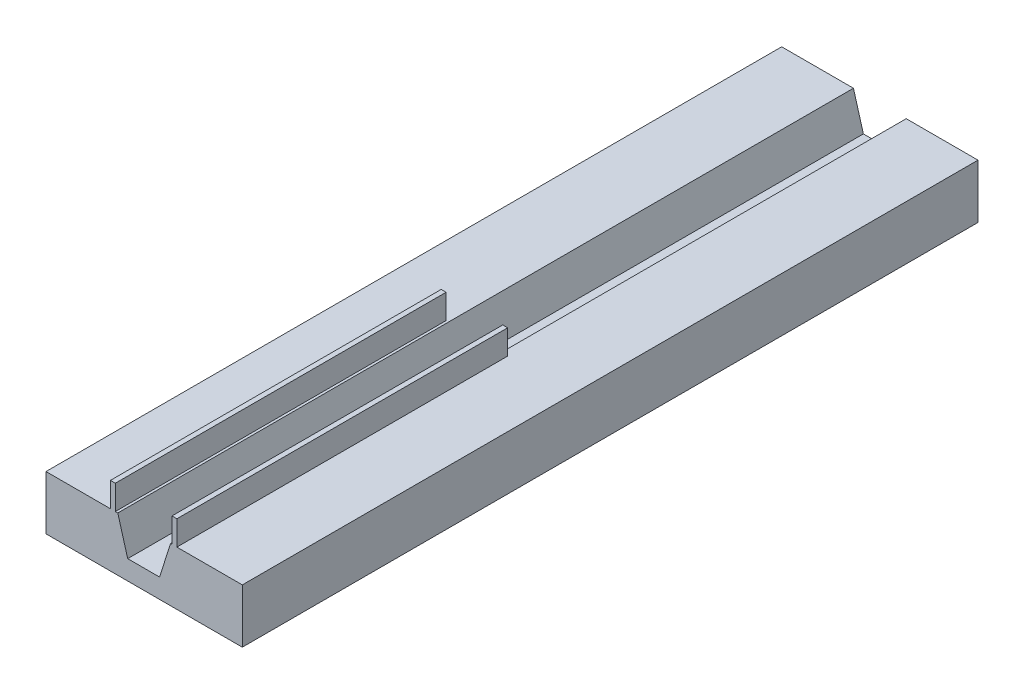
ISO-10303-21;
HEADER;
FILE_DESCRIPTION(('STEP AP214'),'2;1');
FILE_NAME('part.step','',(''),(''),'','','');
FILE_SCHEMA(('AUTOMOTIVE_DESIGN { 1 0 10303 214 1 1 1 1 }'));
ENDSEC;
DATA;
#1=APPLICATION_CONTEXT('core data for automotive mechanical design processes');
#2=APPLICATION_PROTOCOL_DEFINITION('international standard','automotive_design',2000,#1);
#3=PRODUCT_CONTEXT('',#1,'mechanical');
#4=PRODUCT('Part','Part','',(#3));
#5=PRODUCT_RELATED_PRODUCT_CATEGORY('part','',(#4));
#6=PRODUCT_DEFINITION_FORMATION('','',#4);
#7=PRODUCT_DEFINITION_CONTEXT('part definition',#1,'design');
#8=PRODUCT_DEFINITION('design','',#6,#7);
#9=PRODUCT_DEFINITION_SHAPE('','',#8);
#10=(LENGTH_UNIT() NAMED_UNIT(*) SI_UNIT(.MILLI.,.METRE.));
#11=(NAMED_UNIT(*) PLANE_ANGLE_UNIT() SI_UNIT($,.RADIAN.));
#12=(NAMED_UNIT(*) SI_UNIT($,.STERADIAN.) SOLID_ANGLE_UNIT());
#13=UNCERTAINTY_MEASURE_WITH_UNIT(LENGTH_MEASURE(1.E-05),#10,'distance_accuracy_value','');
#14=(GEOMETRIC_REPRESENTATION_CONTEXT(3) GLOBAL_UNCERTAINTY_ASSIGNED_CONTEXT((#13)) GLOBAL_UNIT_ASSIGNED_CONTEXT((#10,
#11,#12)) REPRESENTATION_CONTEXT('',''));
#15=CARTESIAN_POINT('',(0.,0.,0.));
#16=DIRECTION('',(0.,0.,1.));
#17=DIRECTION('',(1.,0.,0.));
#18=AXIS2_PLACEMENT_3D('',#15,#16,#17);
#19=CARTESIAN_POINT('',(10.9568900608007,14.1,-299.79));
#20=DIRECTION('',(0.,1.,0.));
#21=DIRECTION('',(-1.,0.,0.));
#22=AXIS2_PLACEMENT_3D('',#19,#20,#21);
#23=PLANE('',#22);
#24=DIRECTION('',(-1.,0.,0.));
#25=VECTOR('',#24,1.);
#26=CARTESIAN_POINT('',(10.9568900608007,14.1,0.));
#27=LINE('',#26,#25);
#28=CARTESIAN_POINT('',(11.5431099391993,14.1,0.));
#29=VERTEX_POINT('',#28);
#30=CARTESIAN_POINT('',(10.9568900608007,14.1,0.));
#31=VERTEX_POINT('',#30);
#32=EDGE_CURVE('E255',#29,#31,#27,.T.);
#33=ORIENTED_EDGE('',*,*,#32,.F.);
#34=DIRECTION('',(0.,0.,1.));
#35=VECTOR('',#34,1.);
#36=CARTESIAN_POINT('',(11.5431099391993,14.1,-134.79));
#37=LINE('',#36,#35);
#38=CARTESIAN_POINT('',(11.5431099391993,14.1,-134.79));
#39=VERTEX_POINT('',#38);
#40=EDGE_CURVE('E62',#39,#29,#37,.T.);
#41=ORIENTED_EDGE('',*,*,#40,.F.);
#42=DIRECTION('',(-1.,0.,0.));
#43=VECTOR('',#42,1.);
#44=CARTESIAN_POINT('',(13.5431099391993,14.1,-134.79));
#45=LINE('',#44,#43);
#46=CARTESIAN_POINT('',(13.5431099391993,14.1,-134.79));
#47=VERTEX_POINT('',#46);
#48=EDGE_CURVE('E164',#47,#39,#45,.T.);
#49=ORIENTED_EDGE('',*,*,#48,.F.);
#50=DIRECTION('',(0.,0.,1.));
#51=VECTOR('',#50,1.);
#52=CARTESIAN_POINT('',(13.5431099391993,14.1,-134.79));
#53=LINE('',#52,#51);
#54=CARTESIAN_POINT('',(13.5431099391993,14.1,0.));
#55=VERTEX_POINT('',#54);
#56=EDGE_CURVE('E172',#47,#55,#53,.T.);
#57=ORIENTED_EDGE('',*,*,#56,.T.);
#58=CARTESIAN_POINT('',(40.2068900608007,14.1,0.));
#59=VERTEX_POINT('',#58);
#60=EDGE_CURVE('E256',#59,#55,#27,.T.);
#61=ORIENTED_EDGE('',*,*,#60,.F.);
#62=DIRECTION('',(0.,0.,1.));
#63=VECTOR('',#62,1.);
#64=CARTESIAN_POINT('',(40.2068900608007,14.1,-299.79));
#65=LINE('',#64,#63);
#66=CARTESIAN_POINT('',(40.2068900608007,14.1,-299.79));
#67=VERTEX_POINT('',#66);
#68=EDGE_CURVE('E283',#67,#59,#65,.T.);
#69=ORIENTED_EDGE('',*,*,#68,.F.);
#70=DIRECTION('',(-1.,0.,0.));
#71=VECTOR('',#70,1.);
#72=CARTESIAN_POINT('',(10.9568900608007,14.1,-299.79));
#73=LINE('',#72,#71);
#74=CARTESIAN_POINT('',(10.9568900608007,14.1,-299.79));
#75=VERTEX_POINT('',#74);
#76=EDGE_CURVE('E232',#67,#75,#73,.T.);
#77=ORIENTED_EDGE('',*,*,#76,.T.);
#78=DIRECTION('',(0.,0.,1.));
#79=VECTOR('',#78,1.);
#80=CARTESIAN_POINT('',(10.9568900608007,14.1,-299.79));
#81=LINE('',#80,#79);
#82=EDGE_CURVE('E281',#75,#31,#81,.T.);
#83=ORIENTED_EDGE('',*,*,#82,.T.);
#84=EDGE_LOOP('',(#33,#41,#49,#57,#61,#69,#77,#83));
#85=FACE_BOUND('',#84,.T.);
#86=ADVANCED_FACE('F45',(#85),#23,.T.);
#87=CARTESIAN_POINT('',(-39.7931099391993,-7.90000000000001,-299.79));
#88=DIRECTION('',(0.,-1.,0.));
#89=DIRECTION('',(0.,0.,-1.));
#90=AXIS2_PLACEMENT_3D('',#87,#88,#89);
#91=PLANE('',#90);
#92=DIRECTION('',(1.,0.,0.));
#93=VECTOR('',#92,1.);
#94=CARTESIAN_POINT('',(-39.7931099391993,-7.90000000000001,0.));
#95=LINE('',#94,#93);
#96=CARTESIAN_POINT('',(-39.7931099391993,-7.90000000000001,0.));
#97=VERTEX_POINT('',#96);
#98=CARTESIAN_POINT('',(40.2068900608007,-7.90000000000001,0.));
#99=VERTEX_POINT('',#98);
#100=EDGE_CURVE('E218',#97,#99,#95,.T.);
#101=ORIENTED_EDGE('',*,*,#100,.F.);
#102=DIRECTION('',(0.,0.,1.));
#103=VECTOR('',#102,1.);
#104=CARTESIAN_POINT('',(-39.7931099391993,-7.90000000000001,-299.79));
#105=LINE('',#104,#103);
#106=CARTESIAN_POINT('',(-39.7931099391993,-7.90000000000001,-299.79));
#107=VERTEX_POINT('',#106);
#108=EDGE_CURVE('E11',#107,#97,#105,.T.);
#109=ORIENTED_EDGE('',*,*,#108,.F.);
#110=DIRECTION('',(1.,0.,0.));
#111=VECTOR('',#110,1.);
#112=CARTESIAN_POINT('',(-39.7931099391993,-7.90000000000001,-299.79));
#113=LINE('',#112,#111);
#114=CARTESIAN_POINT('',(40.2068900608007,-7.90000000000001,-299.79));
#115=VERTEX_POINT('',#114);
#116=EDGE_CURVE('E225',#107,#115,#113,.T.);
#117=ORIENTED_EDGE('',*,*,#116,.T.);
#118=DIRECTION('',(0.,0.,1.));
#119=VECTOR('',#118,1.);
#120=CARTESIAN_POINT('',(40.2068900608007,-7.90000000000001,-299.79));
#121=LINE('',#120,#119);
#122=EDGE_CURVE('E49',#115,#99,#121,.T.);
#123=ORIENTED_EDGE('',*,*,#122,.T.);
#124=EDGE_LOOP('',(#101,#109,#117,#123));
#125=FACE_BOUND('',#124,.T.);
#126=ADVANCED_FACE('F47',(#125),#91,.T.);
#127=CARTESIAN_POINT('',(-39.7931099391993,14.1,-299.79));
#128=DIRECTION('',(-1.,0.,0.));
#129=DIRECTION('',(0.,-1.,0.));
#130=AXIS2_PLACEMENT_3D('',#127,#128,#129);
#131=PLANE('',#130);
#132=DIRECTION('',(0.,-1.,0.));
#133=VECTOR('',#132,1.);
#134=CARTESIAN_POINT('',(-39.7931099391993,14.1,0.));
#135=LINE('',#134,#133);
#136=CARTESIAN_POINT('',(-39.7931099391993,14.1,0.));
#137=VERTEX_POINT('',#136);
#138=EDGE_CURVE('E229',#137,#97,#135,.T.);
#139=ORIENTED_EDGE('',*,*,#138,.F.);
#140=DIRECTION('',(0.,0.,1.));
#141=VECTOR('',#140,1.);
#142=CARTESIAN_POINT('',(-39.7931099391993,14.1,-299.79));
#143=LINE('',#142,#141);
#144=CARTESIAN_POINT('',(-39.7931099391993,14.1,-299.79));
#145=VERTEX_POINT('',#144);
#146=EDGE_CURVE('E54',#145,#137,#143,.T.);
#147=ORIENTED_EDGE('',*,*,#146,.F.);
#148=DIRECTION('',(0.,-1.,0.));
#149=VECTOR('',#148,1.);
#150=CARTESIAN_POINT('',(-39.7931099391993,14.1,-299.79));
#151=LINE('',#150,#149);
#152=EDGE_CURVE('E247',#145,#107,#151,.T.);
#153=ORIENTED_EDGE('',*,*,#152,.T.);
#154=ORIENTED_EDGE('',*,*,#108,.T.);
#155=EDGE_LOOP('',(#139,#147,#153,#154));
#156=FACE_BOUND('',#155,.T.);
#157=ADVANCED_FACE('F295',(#156),#131,.T.);
#158=CARTESIAN_POINT('',(-39.7931099391993,14.1,-299.79));
#159=DIRECTION('',(0.,1.,0.));
#160=DIRECTION('',(-1.,0.,0.));
#161=AXIS2_PLACEMENT_3D('',#158,#159,#160);
#162=PLANE('',#161);
#163=DIRECTION('',(0.,0.,1.));
#164=VECTOR('',#163,1.);
#165=CARTESIAN_POINT('',(-13.5431099391993,14.1,-134.79));
#166=LINE('',#165,#164);
#167=CARTESIAN_POINT('',(-13.5431099391993,14.1,-134.79));
#168=VERTEX_POINT('',#167);
#169=CARTESIAN_POINT('',(-13.5431099391993,14.1,0.));
#170=VERTEX_POINT('',#169);
#171=EDGE_CURVE('E216',#168,#170,#166,.T.);
#172=ORIENTED_EDGE('',*,*,#171,.F.);
#173=DIRECTION('',(1.,0.,0.));
#174=VECTOR('',#173,1.);
#175=CARTESIAN_POINT('',(-13.5431099391993,14.1,-134.79));
#176=LINE('',#175,#174);
#177=CARTESIAN_POINT('',(-11.5431099391993,14.1,-134.79));
#178=VERTEX_POINT('',#177);
#179=EDGE_CURVE('E198',#168,#178,#176,.T.);
#180=ORIENTED_EDGE('',*,*,#179,.T.);
#181=DIRECTION('',(0.,0.,1.));
#182=VECTOR('',#181,1.);
#183=CARTESIAN_POINT('',(-11.5431099391993,14.1,-134.79));
#184=LINE('',#183,#182);
#185=CARTESIAN_POINT('',(-11.5431099391993,14.1,0.));
#186=VERTEX_POINT('',#185);
#187=EDGE_CURVE('E210',#178,#186,#184,.T.);
#188=ORIENTED_EDGE('',*,*,#187,.T.);
#189=DIRECTION('',(-1.,0.,0.));
#190=VECTOR('',#189,1.);
#191=CARTESIAN_POINT('',(-39.7931099391993,14.1,0.));
#192=LINE('',#191,#190);
#193=CARTESIAN_POINT('',(-10.5431099391993,14.1,0.));
#194=VERTEX_POINT('',#193);
#195=EDGE_CURVE('E268',#194,#186,#192,.T.);
#196=ORIENTED_EDGE('',*,*,#195,.F.);
#197=DIRECTION('',(0.,0.,1.));
#198=VECTOR('',#197,1.);
#199=CARTESIAN_POINT('',(-10.5431099391993,14.1,-299.79));
#200=LINE('',#199,#198);
#201=CARTESIAN_POINT('',(-10.5431099391993,14.1,-299.79));
#202=VERTEX_POINT('',#201);
#203=EDGE_CURVE('E275',#202,#194,#200,.T.);
#204=ORIENTED_EDGE('',*,*,#203,.F.);
#205=DIRECTION('',(-1.,0.,0.));
#206=VECTOR('',#205,1.);
#207=CARTESIAN_POINT('',(-39.7931099391993,14.1,-299.79));
#208=LINE('',#207,#206);
#209=EDGE_CURVE('E244',#202,#145,#208,.T.);
#210=ORIENTED_EDGE('',*,*,#209,.T.);
#211=ORIENTED_EDGE('',*,*,#146,.T.);
#212=EDGE_CURVE('E267',#170,#137,#192,.T.);
#213=ORIENTED_EDGE('',*,*,#212,.F.);
#214=EDGE_LOOP('',(#172,#180,#188,#196,#204,#210,#211,#213));
#215=FACE_BOUND('',#214,.T.);
#216=ADVANCED_FACE('F350',(#215),#162,.T.);
#217=CARTESIAN_POINT('',(-10.5431099391993,14.1,-299.79));
#218=DIRECTION('',(0.961261695938318,0.275637355817003,0.));
#219=DIRECTION('',(-0.275637355817003,0.961261695938318,0.));
#220=AXIS2_PLACEMENT_3D('',#217,#218,#219);
#221=PLANE('',#220);
#222=DIRECTION('',(-0.275637355817003,0.961261695938318,0.));
#223=VECTOR('',#222,1.);
#224=CARTESIAN_POINT('',(-10.5431099391993,14.1,0.));
#225=LINE('',#224,#223);
#226=CARTESIAN_POINT('',(-6.5,0.,0.));
#227=VERTEX_POINT('',#226);
#228=EDGE_CURVE('E264',#227,#194,#225,.T.);
#229=ORIENTED_EDGE('',*,*,#228,.F.);
#230=DIRECTION('',(0.,0.,1.));
#231=VECTOR('',#230,1.);
#232=CARTESIAN_POINT('',(-6.5,0.,-299.79));
#233=LINE('',#232,#231);
#234=CARTESIAN_POINT('',(-6.5,0.,-299.79));
#235=VERTEX_POINT('',#234);
#236=EDGE_CURVE('E277',#235,#227,#233,.T.);
#237=ORIENTED_EDGE('',*,*,#236,.F.);
#238=DIRECTION('',(-0.275637355817003,0.961261695938318,0.));
#239=VECTOR('',#238,1.);
#240=CARTESIAN_POINT('',(-10.5431099391993,14.1,-299.79));
#241=LINE('',#240,#239);
#242=EDGE_CURVE('E241',#235,#202,#241,.T.);
#243=ORIENTED_EDGE('',*,*,#242,.T.);
#244=ORIENTED_EDGE('',*,*,#203,.T.);
#245=EDGE_LOOP('',(#229,#237,#243,#244));
#246=FACE_BOUND('',#245,.T.);
#247=ADVANCED_FACE('F341',(#246),#221,.T.);
#248=CARTESIAN_POINT('',(-6.5,0.,-299.79));
#249=DIRECTION('',(0.,1.,0.));
#250=DIRECTION('',(0.,0.,1.));
#251=AXIS2_PLACEMENT_3D('',#248,#249,#250);
#252=PLANE('',#251);
#253=DIRECTION('',(-1.,0.,0.));
#254=VECTOR('',#253,1.);
#255=CARTESIAN_POINT('',(-6.5,0.,0.));
#256=LINE('',#255,#254);
#257=CARTESIAN_POINT('',(6.5,0.,0.));
#258=VERTEX_POINT('',#257);
#259=EDGE_CURVE('E261',#258,#227,#256,.T.);
#260=ORIENTED_EDGE('',*,*,#259,.F.);
#261=DIRECTION('',(0.,0.,1.));
#262=VECTOR('',#261,1.);
#263=CARTESIAN_POINT('',(6.5,0.,-299.79));
#264=LINE('',#263,#262);
#265=CARTESIAN_POINT('',(6.5,0.,-299.79));
#266=VERTEX_POINT('',#265);
#267=EDGE_CURVE('E279',#266,#258,#264,.T.);
#268=ORIENTED_EDGE('',*,*,#267,.F.);
#269=DIRECTION('',(-1.,0.,0.));
#270=VECTOR('',#269,1.);
#271=CARTESIAN_POINT('',(-6.5,0.,-299.79));
#272=LINE('',#271,#270);
#273=EDGE_CURVE('E238',#266,#235,#272,.T.);
#274=ORIENTED_EDGE('',*,*,#273,.T.);
#275=ORIENTED_EDGE('',*,*,#236,.T.);
#276=EDGE_LOOP('',(#260,#268,#274,#275));
#277=FACE_BOUND('',#276,.T.);
#278=ADVANCED_FACE('F336',(#277),#252,.T.);
#279=CARTESIAN_POINT('',(6.5,0.,-299.79));
#280=DIRECTION('',(-0.95349993580738,0.301393218927238,0.));
#281=DIRECTION('',(-0.301393218927238,-0.95349993580738,0.));
#282=AXIS2_PLACEMENT_3D('',#279,#280,#281);
#283=PLANE('',#282);
#284=DIRECTION('',(-0.301393218927238,-0.95349993580738,0.));
#285=VECTOR('',#284,1.);
#286=CARTESIAN_POINT('',(6.5,0.,0.));
#287=LINE('',#286,#285);
#288=EDGE_CURVE('E258',#31,#258,#287,.T.);
#289=ORIENTED_EDGE('',*,*,#288,.F.);
#290=ORIENTED_EDGE('',*,*,#82,.F.);
#291=DIRECTION('',(-0.301393218927238,-0.95349993580738,0.));
#292=VECTOR('',#291,1.);
#293=CARTESIAN_POINT('',(6.5,0.,-299.79));
#294=LINE('',#293,#292);
#295=EDGE_CURVE('E235',#75,#266,#294,.T.);
#296=ORIENTED_EDGE('',*,*,#295,.T.);
#297=ORIENTED_EDGE('',*,*,#267,.T.);
#298=EDGE_LOOP('',(#289,#290,#296,#297));
#299=FACE_BOUND('',#298,.T.);
#300=ADVANCED_FACE('F328',(#299),#283,.T.);
#301=CARTESIAN_POINT('',(40.2068900608007,-7.90000000000001,-299.79));
#302=DIRECTION('',(1.,0.,0.));
#303=DIRECTION('',(0.,0.,-1.));
#304=AXIS2_PLACEMENT_3D('',#301,#302,#303);
#305=PLANE('',#304);
#306=DIRECTION('',(0.,1.,0.));
#307=VECTOR('',#306,1.);
#308=CARTESIAN_POINT('',(40.2068900608007,-7.90000000000001,0.));
#309=LINE('',#308,#307);
#310=EDGE_CURVE('E252',#99,#59,#309,.T.);
#311=ORIENTED_EDGE('',*,*,#310,.F.);
#312=ORIENTED_EDGE('',*,*,#122,.F.);
#313=DIRECTION('',(0.,1.,0.));
#314=VECTOR('',#313,1.);
#315=CARTESIAN_POINT('',(40.2068900608007,-7.90000000000001,-299.79));
#316=LINE('',#315,#314);
#317=EDGE_CURVE('E228',#115,#67,#316,.T.);
#318=ORIENTED_EDGE('',*,*,#317,.T.);
#319=ORIENTED_EDGE('',*,*,#68,.T.);
#320=EDGE_LOOP('',(#311,#312,#318,#319));
#321=FACE_BOUND('',#320,.T.);
#322=ADVANCED_FACE('F290',(#321),#305,.T.);
#323=CARTESIAN_POINT('',(0.,0.,-299.79));
#324=DIRECTION('',(0.,0.,1.));
#325=DIRECTION('',(1.,0.,0.));
#326=AXIS2_PLACEMENT_3D('',#323,#324,#325);
#327=PLANE('',#326);
#328=ORIENTED_EDGE('',*,*,#116,.F.);
#329=ORIENTED_EDGE('',*,*,#152,.F.);
#330=ORIENTED_EDGE('',*,*,#209,.F.);
#331=ORIENTED_EDGE('',*,*,#242,.F.);
#332=ORIENTED_EDGE('',*,*,#273,.F.);
#333=ORIENTED_EDGE('',*,*,#295,.F.);
#334=ORIENTED_EDGE('',*,*,#76,.F.);
#335=ORIENTED_EDGE('',*,*,#317,.F.);
#336=EDGE_LOOP('',(#328,#329,#330,#331,#332,#333,#334,#335));
#337=FACE_BOUND('',#336,.T.);
#338=ADVANCED_FACE('F298',(#337),#327,.F.);
#339=CARTESIAN_POINT('',(0.,0.,0.));
#340=DIRECTION('',(0.,0.,1.));
#341=DIRECTION('',(1.,0.,0.));
#342=AXIS2_PLACEMENT_3D('',#339,#340,#341);
#343=PLANE('',#342);
#344=ORIENTED_EDGE('',*,*,#100,.T.);
#345=ORIENTED_EDGE('',*,*,#310,.T.);
#346=ORIENTED_EDGE('',*,*,#60,.T.);
#347=DIRECTION('',(0.,-1.,0.));
#348=VECTOR('',#347,1.);
#349=CARTESIAN_POINT('',(13.5431099391993,24.1,0.));
#350=LINE('',#349,#348);
#351=CARTESIAN_POINT('',(13.5431099391993,24.1,0.));
#352=VERTEX_POINT('',#351);
#353=EDGE_CURVE('E175',#352,#55,#350,.T.);
#354=ORIENTED_EDGE('',*,*,#353,.F.);
#355=DIRECTION('',(1.,0.,0.));
#356=VECTOR('',#355,1.);
#357=CARTESIAN_POINT('',(11.5431099391993,24.1,0.));
#358=LINE('',#357,#356);
#359=CARTESIAN_POINT('',(11.5431099391993,24.1,0.));
#360=VERTEX_POINT('',#359);
#361=EDGE_CURVE('E185',#360,#352,#358,.T.);
#362=ORIENTED_EDGE('',*,*,#361,.F.);
#363=DIRECTION('',(0.,1.,0.));
#364=VECTOR('',#363,1.);
#365=CARTESIAN_POINT('',(11.5431099391993,14.1,0.));
#366=LINE('',#365,#364);
#367=EDGE_CURVE('E183',#29,#360,#366,.T.);
#368=ORIENTED_EDGE('',*,*,#367,.F.);
#369=ORIENTED_EDGE('',*,*,#32,.T.);
#370=ORIENTED_EDGE('',*,*,#288,.T.);
#371=ORIENTED_EDGE('',*,*,#259,.T.);
#372=ORIENTED_EDGE('',*,*,#228,.T.);
#373=ORIENTED_EDGE('',*,*,#195,.T.);
#374=DIRECTION('',(0.,1.,0.));
#375=VECTOR('',#374,1.);
#376=CARTESIAN_POINT('',(-11.5431099391993,14.1,0.));
#377=LINE('',#376,#375);
#378=CARTESIAN_POINT('',(-11.5431099391993,24.1,0.));
#379=VERTEX_POINT('',#378);
#380=EDGE_CURVE('E193',#186,#379,#377,.T.);
#381=ORIENTED_EDGE('',*,*,#380,.T.);
#382=DIRECTION('',(-1.,0.,0.));
#383=VECTOR('',#382,1.);
#384=CARTESIAN_POINT('',(-11.5431099391993,24.1,0.));
#385=LINE('',#384,#383);
#386=CARTESIAN_POINT('',(-13.5431099391993,24.1,0.));
#387=VERTEX_POINT('',#386);
#388=EDGE_CURVE('E213',#379,#387,#385,.T.);
#389=ORIENTED_EDGE('',*,*,#388,.T.);
#390=DIRECTION('',(0.,-1.,0.));
#391=VECTOR('',#390,1.);
#392=CARTESIAN_POINT('',(-13.5431099391993,24.1,0.));
#393=LINE('',#392,#391);
#394=EDGE_CURVE('E70',#387,#170,#393,.T.);
#395=ORIENTED_EDGE('',*,*,#394,.T.);
#396=ORIENTED_EDGE('',*,*,#212,.T.);
#397=ORIENTED_EDGE('',*,*,#138,.T.);
#398=EDGE_LOOP('',(#344,#345,#346,#354,#362,#368,#369,#370,#371,#372,#373,#381,#389,#395,#396,#397));
#399=FACE_BOUND('',#398,.T.);
#400=ADVANCED_FACE('F291',(#399),#343,.T.);
#401=CARTESIAN_POINT('',(-13.5431099391993,24.1,-134.79));
#402=DIRECTION('',(-1.,0.,0.));
#403=DIRECTION('',(0.,-1.,0.));
#404=AXIS2_PLACEMENT_3D('',#401,#402,#403);
#405=PLANE('',#404);
#406=ORIENTED_EDGE('',*,*,#394,.F.);
#407=DIRECTION('',(0.,0.,1.));
#408=VECTOR('',#407,1.);
#409=CARTESIAN_POINT('',(-13.5431099391993,24.1,-134.79));
#410=LINE('',#409,#408);
#411=CARTESIAN_POINT('',(-13.5431099391993,24.1,-134.79));
#412=VERTEX_POINT('',#411);
#413=EDGE_CURVE('E219',#412,#387,#410,.T.);
#414=ORIENTED_EDGE('',*,*,#413,.F.);
#415=DIRECTION('',(0.,-1.,0.));
#416=VECTOR('',#415,1.);
#417=CARTESIAN_POINT('',(-13.5431099391993,24.1,-134.79));
#418=LINE('',#417,#416);
#419=EDGE_CURVE('E207',#412,#168,#418,.T.);
#420=ORIENTED_EDGE('',*,*,#419,.T.);
#421=ORIENTED_EDGE('',*,*,#171,.T.);
#422=EDGE_LOOP('',(#406,#414,#420,#421));
#423=FACE_BOUND('',#422,.T.);
#424=ADVANCED_FACE('F359',(#423),#405,.T.);
#425=CARTESIAN_POINT('',(-11.5431099391993,24.1,-134.79));
#426=DIRECTION('',(0.,1.,0.));
#427=DIRECTION('',(-1.,0.,0.));
#428=AXIS2_PLACEMENT_3D('',#425,#426,#427);
#429=PLANE('',#428);
#430=ORIENTED_EDGE('',*,*,#388,.F.);
#431=DIRECTION('',(0.,0.,1.));
#432=VECTOR('',#431,1.);
#433=CARTESIAN_POINT('',(-11.5431099391993,24.1,-134.79));
#434=LINE('',#433,#432);
#435=CARTESIAN_POINT('',(-11.5431099391993,24.1,-134.79));
#436=VERTEX_POINT('',#435);
#437=EDGE_CURVE('E221',#436,#379,#434,.T.);
#438=ORIENTED_EDGE('',*,*,#437,.F.);
#439=DIRECTION('',(-1.,0.,0.));
#440=VECTOR('',#439,1.);
#441=CARTESIAN_POINT('',(-11.5431099391993,24.1,-134.79));
#442=LINE('',#441,#440);
#443=EDGE_CURVE('E204',#436,#412,#442,.T.);
#444=ORIENTED_EDGE('',*,*,#443,.T.);
#445=ORIENTED_EDGE('',*,*,#413,.T.);
#446=EDGE_LOOP('',(#430,#438,#444,#445));
#447=FACE_BOUND('',#446,.T.);
#448=ADVANCED_FACE('F356',(#447),#429,.T.);
#449=CARTESIAN_POINT('',(-11.5431099391993,14.1,-134.79));
#450=DIRECTION('',(1.,0.,0.));
#451=DIRECTION('',(0.,0.,-1.));
#452=AXIS2_PLACEMENT_3D('',#449,#450,#451);
#453=PLANE('',#452);
#454=ORIENTED_EDGE('',*,*,#380,.F.);
#455=ORIENTED_EDGE('',*,*,#187,.F.);
#456=DIRECTION('',(0.,1.,0.));
#457=VECTOR('',#456,1.);
#458=CARTESIAN_POINT('',(-11.5431099391993,14.1,-134.79));
#459=LINE('',#458,#457);
#460=EDGE_CURVE('E201',#178,#436,#459,.T.);
#461=ORIENTED_EDGE('',*,*,#460,.T.);
#462=ORIENTED_EDGE('',*,*,#437,.T.);
#463=EDGE_LOOP('',(#454,#455,#461,#462));
#464=FACE_BOUND('',#463,.T.);
#465=ADVANCED_FACE('F318',(#464),#453,.T.);
#466=CARTESIAN_POINT('',(0.,0.,-134.79));
#467=DIRECTION('',(0.,0.,1.));
#468=DIRECTION('',(1.,0.,0.));
#469=AXIS2_PLACEMENT_3D('',#466,#467,#468);
#470=PLANE('',#469);
#471=ORIENTED_EDGE('',*,*,#179,.F.);
#472=ORIENTED_EDGE('',*,*,#419,.F.);
#473=ORIENTED_EDGE('',*,*,#443,.F.);
#474=ORIENTED_EDGE('',*,*,#460,.F.);
#475=EDGE_LOOP('',(#471,#472,#473,#474));
#476=FACE_BOUND('',#475,.T.);
#477=ADVANCED_FACE('F310',(#476),#470,.F.);
#478=CARTESIAN_POINT('',(11.5431099391993,14.1,-134.79));
#479=DIRECTION('',(1.,0.,0.));
#480=DIRECTION('',(0.,0.,-1.));
#481=AXIS2_PLACEMENT_3D('',#478,#479,#480);
#482=PLANE('',#481);
#483=ORIENTED_EDGE('',*,*,#367,.T.);
#484=DIRECTION('',(0.,0.,1.));
#485=VECTOR('',#484,1.);
#486=CARTESIAN_POINT('',(11.5431099391993,24.1,-134.79));
#487=LINE('',#486,#485);
#488=CARTESIAN_POINT('',(11.5431099391993,24.1,-134.79));
#489=VERTEX_POINT('',#488);
#490=EDGE_CURVE('E194',#489,#360,#487,.T.);
#491=ORIENTED_EDGE('',*,*,#490,.F.);
#492=DIRECTION('',(0.,1.,0.));
#493=VECTOR('',#492,1.);
#494=CARTESIAN_POINT('',(11.5431099391993,14.1,-134.79));
#495=LINE('',#494,#493);
#496=EDGE_CURVE('E180',#39,#489,#495,.T.);
#497=ORIENTED_EDGE('',*,*,#496,.F.);
#498=ORIENTED_EDGE('',*,*,#40,.T.);
#499=EDGE_LOOP('',(#483,#491,#497,#498));
#500=FACE_BOUND('',#499,.T.);
#501=ADVANCED_FACE('F308',(#500),#482,.F.);
#502=CARTESIAN_POINT('',(11.5431099391993,24.1,-134.79));
#503=DIRECTION('',(0.,-1.,0.));
#504=DIRECTION('',(1.,0.,0.));
#505=AXIS2_PLACEMENT_3D('',#502,#503,#504);
#506=PLANE('',#505);
#507=ORIENTED_EDGE('',*,*,#361,.T.);
#508=DIRECTION('',(0.,0.,1.));
#509=VECTOR('',#508,1.);
#510=CARTESIAN_POINT('',(13.5431099391993,24.1,-134.79));
#511=LINE('',#510,#509);
#512=CARTESIAN_POINT('',(13.5431099391993,24.1,-134.79));
#513=VERTEX_POINT('',#512);
#514=EDGE_CURVE('E179',#513,#352,#511,.T.);
#515=ORIENTED_EDGE('',*,*,#514,.F.);
#516=DIRECTION('',(1.,0.,0.));
#517=VECTOR('',#516,1.);
#518=CARTESIAN_POINT('',(11.5431099391993,24.1,-134.79));
#519=LINE('',#518,#517);
#520=EDGE_CURVE('E166',#489,#513,#519,.T.);
#521=ORIENTED_EDGE('',*,*,#520,.F.);
#522=ORIENTED_EDGE('',*,*,#490,.T.);
#523=EDGE_LOOP('',(#507,#515,#521,#522));
#524=FACE_BOUND('',#523,.T.);
#525=ADVANCED_FACE('F306',(#524),#506,.F.);
#526=CARTESIAN_POINT('',(13.5431099391993,24.1,-134.79));
#527=DIRECTION('',(-1.,0.,0.));
#528=DIRECTION('',(0.,-1.,0.));
#529=AXIS2_PLACEMENT_3D('',#526,#527,#528);
#530=PLANE('',#529);
#531=ORIENTED_EDGE('',*,*,#353,.T.);
#532=ORIENTED_EDGE('',*,*,#56,.F.);
#533=DIRECTION('',(0.,-1.,0.));
#534=VECTOR('',#533,1.);
#535=CARTESIAN_POINT('',(13.5431099391993,24.1,-134.79));
#536=LINE('',#535,#534);
#537=EDGE_CURVE('E160',#513,#47,#536,.T.);
#538=ORIENTED_EDGE('',*,*,#537,.F.);
#539=ORIENTED_EDGE('',*,*,#514,.T.);
#540=EDGE_LOOP('',(#531,#532,#538,#539));
#541=FACE_BOUND('',#540,.T.);
#542=ADVANCED_FACE('F173',(#541),#530,.F.);
#543=CARTESIAN_POINT('',(0.,0.,-134.79));
#544=DIRECTION('',(0.,0.,1.));
#545=DIRECTION('',(-1.,0.,0.));
#546=AXIS2_PLACEMENT_3D('',#543,#544,#545);
#547=PLANE('',#546);
#548=ORIENTED_EDGE('',*,*,#48,.T.);
#549=ORIENTED_EDGE('',*,*,#496,.T.);
#550=ORIENTED_EDGE('',*,*,#520,.T.);
#551=ORIENTED_EDGE('',*,*,#537,.T.);
#552=EDGE_LOOP('',(#548,#549,#550,#551));
#553=FACE_BOUND('',#552,.T.);
#554=ADVANCED_FACE('F162',(#553),#547,.F.);
#555=CLOSED_SHELL('',(#86,#126,#157,#216,#247,#278,#300,#322,#338,#400,#424,#448,#465,#477,#501,
#525,#542,#554));
#556=MANIFOLD_SOLID_BREP('B2',#555);
#557=ADVANCED_BREP_SHAPE_REPRESENTATION('',(#18,#556),#14);
#558=SHAPE_DEFINITION_REPRESENTATION(#9,#557);
ENDSEC;
END-ISO-10303-21;
